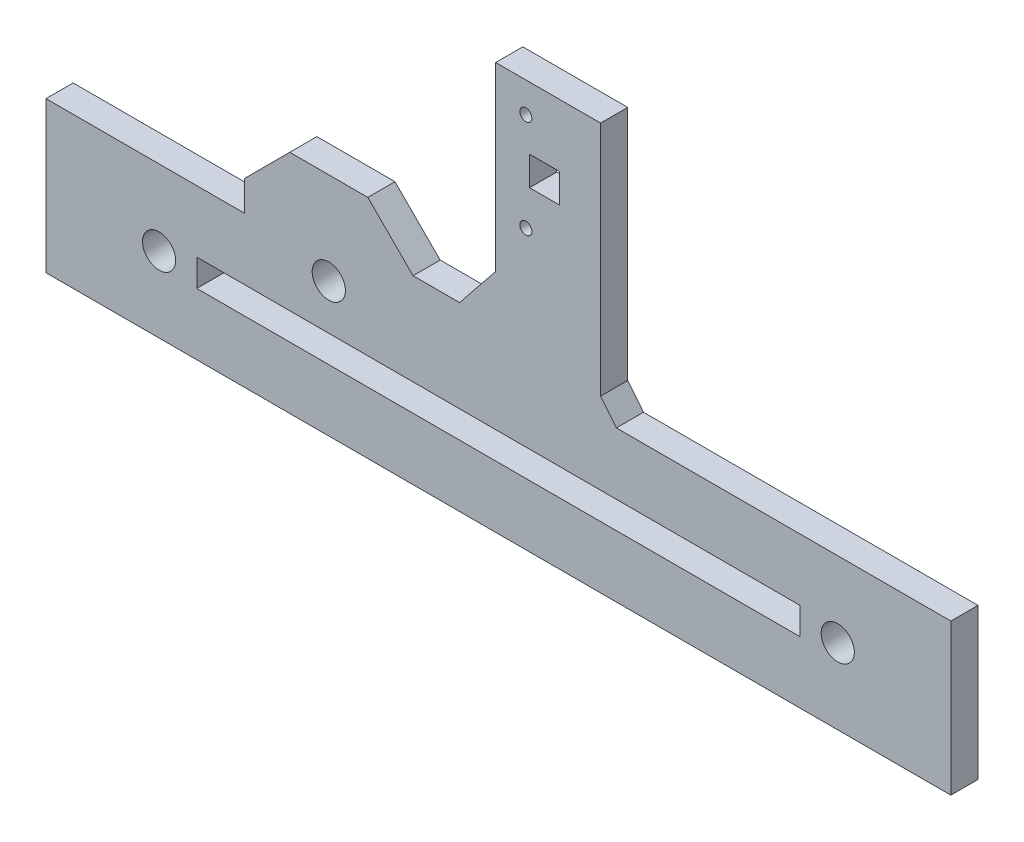
ISO-10303-21;
HEADER;
FILE_DESCRIPTION(('STEP AP214'),'2;1');
FILE_NAME('part.step','',(''),(''),'','','');
FILE_SCHEMA(('AUTOMOTIVE_DESIGN { 1 0 10303 214 1 1 1 1 }'));
ENDSEC;
DATA;
#1=APPLICATION_CONTEXT('core data for automotive mechanical design processes');
#2=APPLICATION_PROTOCOL_DEFINITION('international standard','automotive_design',2000,#1);
#3=PRODUCT_CONTEXT('',#1,'mechanical');
#4=PRODUCT('Part','Part','',(#3));
#5=PRODUCT_RELATED_PRODUCT_CATEGORY('part','',(#4));
#6=PRODUCT_DEFINITION_FORMATION('','',#4);
#7=PRODUCT_DEFINITION_CONTEXT('part definition',#1,'design');
#8=PRODUCT_DEFINITION('design','',#6,#7);
#9=PRODUCT_DEFINITION_SHAPE('','',#8);
#10=(LENGTH_UNIT() NAMED_UNIT(*) SI_UNIT(.MILLI.,.METRE.));
#11=(NAMED_UNIT(*) PLANE_ANGLE_UNIT() SI_UNIT($,.RADIAN.));
#12=(NAMED_UNIT(*) SI_UNIT($,.STERADIAN.) SOLID_ANGLE_UNIT());
#13=UNCERTAINTY_MEASURE_WITH_UNIT(LENGTH_MEASURE(1.E-05),#10,'distance_accuracy_value','');
#14=(GEOMETRIC_REPRESENTATION_CONTEXT(3) GLOBAL_UNCERTAINTY_ASSIGNED_CONTEXT((#13)) GLOBAL_UNIT_ASSIGNED_CONTEXT((#10,
#11,#12)) REPRESENTATION_CONTEXT('',''));
#15=CARTESIAN_POINT('',(0.,0.,0.));
#16=DIRECTION('',(0.,0.,1.));
#17=DIRECTION('',(1.,0.,0.));
#18=AXIS2_PLACEMENT_3D('',#15,#16,#17);
#19=CARTESIAN_POINT('',(-49.841675886682,40.0010063210798,0.));
#20=DIRECTION('',(-0.779893402413548,0.625912358778623,0.));
#21=DIRECTION('',(-0.625912358778623,-0.779893402413548,0.));
#22=AXIS2_PLACEMENT_3D('',#19,#20,#21);
#23=PLANE('',#22);
#24=DIRECTION('',(-0.625912358778623,-0.779893402413548,0.));
#25=VECTOR('',#24,1.);
#26=CARTESIAN_POINT('',(-49.841675886682,40.0010063210798,0.));
#27=LINE('',#26,#25);
#28=CARTESIAN_POINT('',(-1.81686929180978,99.840422,0.));
#29=VERTEX_POINT('',#28);
#30=CARTESIAN_POINT('',(-25.7656408331102,70.,0.));
#31=VERTEX_POINT('',#30);
#32=EDGE_CURVE('E238',#29,#31,#27,.T.);
#33=ORIENTED_EDGE('',*,*,#32,.T.);
#34=DIRECTION('',(0.,0.,1.));
#35=VECTOR('',#34,1.);
#36=CARTESIAN_POINT('',(-25.7656408331102,70.,0.));
#37=LINE('',#36,#35);
#38=CARTESIAN_POINT('',(-25.7656408331102,70.,18.));
#39=VERTEX_POINT('',#38);
#40=EDGE_CURVE('E221',#31,#39,#37,.T.);
#41=ORIENTED_EDGE('',*,*,#40,.T.);
#42=DIRECTION('',(-0.625912358778623,-0.779893402413548,0.));
#43=VECTOR('',#42,1.);
#44=CARTESIAN_POINT('',(-49.841675886682,40.0010063210798,18.));
#45=LINE('',#44,#43);
#46=CARTESIAN_POINT('',(-1.81686929180978,99.840422,18.));
#47=VERTEX_POINT('',#46);
#48=EDGE_CURVE('E257',#47,#39,#45,.T.);
#49=ORIENTED_EDGE('',*,*,#48,.F.);
#50=DIRECTION('',(0.,0.,1.));
#51=VECTOR('',#50,1.);
#52=CARTESIAN_POINT('',(-1.81686929180978,99.840422,0.));
#53=LINE('',#52,#51);
#54=EDGE_CURVE('E273',#29,#47,#53,.T.);
#55=ORIENTED_EDGE('',*,*,#54,.F.);
#56=EDGE_LOOP('',(#33,#41,#49,#55));
#57=FACE_BOUND('',#56,.T.);
#58=ADVANCED_FACE('F36',(#57),#23,.T.);
#59=CARTESIAN_POINT('',(-300.,50.,18.));
#60=DIRECTION('',(0.,-1.,0.));
#61=DIRECTION('',(0.,0.,-1.));
#62=AXIS2_PLACEMENT_3D('',#59,#60,#61);
#63=PLANE('',#62);
#64=DIRECTION('',(0.,0.,1.));
#65=VECTOR('',#64,1.);
#66=CARTESIAN_POINT('',(78.1831307081904,50.,0.));
#67=LINE('',#66,#65);
#68=CARTESIAN_POINT('',(78.1831307081903,50.,0.));
#69=VERTEX_POINT('',#68);
#70=CARTESIAN_POINT('',(78.1831307081903,50.,18.));
#71=VERTEX_POINT('',#70);
#72=EDGE_CURVE('E271',#69,#71,#67,.T.);
#73=ORIENTED_EDGE('',*,*,#72,.T.);
#74=DIRECTION('',(-1.,0.,0.));
#75=VECTOR('',#74,1.);
#76=CARTESIAN_POINT('',(-300.,50.,18.));
#77=LINE('',#76,#75);
#78=CARTESIAN_POINT('',(300.,50.,18.));
#79=VERTEX_POINT('',#78);
#80=EDGE_CURVE('E345',#79,#71,#77,.T.);
#81=ORIENTED_EDGE('',*,*,#80,.F.);
#82=DIRECTION('',(0.,0.,-1.));
#83=VECTOR('',#82,1.);
#84=CARTESIAN_POINT('',(300.,50.,18.));
#85=LINE('',#84,#83);
#86=CARTESIAN_POINT('',(300.,50.,0.));
#87=VERTEX_POINT('',#86);
#88=EDGE_CURVE('E369',#79,#87,#85,.T.);
#89=ORIENTED_EDGE('',*,*,#88,.T.);
#90=DIRECTION('',(-1.,0.,0.));
#91=VECTOR('',#90,1.);
#92=CARTESIAN_POINT('',(-300.,50.,0.));
#93=LINE('',#92,#91);
#94=EDGE_CURVE('E356',#87,#69,#93,.T.);
#95=ORIENTED_EDGE('',*,*,#94,.T.);
#96=EDGE_LOOP('',(#73,#81,#89,#95));
#97=FACE_BOUND('',#96,.T.);
#98=ADVANCED_FACE('F414',(#97),#63,.F.);
#99=DIRECTION('',(0.,0.,1.));
#100=VECTOR('',#99,1.);
#101=CARTESIAN_POINT('',(-168.353087251146,50.,-122.422016476207));
#102=LINE('',#101,#100);
#103=CARTESIAN_POINT('',(-168.353087251146,50.,0.));
#104=VERTEX_POINT('',#103);
#105=CARTESIAN_POINT('',(-168.353087251146,50.,18.));
#106=VERTEX_POINT('',#105);
#107=EDGE_CURVE('E292',#104,#106,#102,.T.);
#108=ORIENTED_EDGE('',*,*,#107,.F.);
#109=CARTESIAN_POINT('',(-300.,50.,0.));
#110=VERTEX_POINT('',#109);
#111=EDGE_CURVE('E355',#104,#110,#93,.T.);
#112=ORIENTED_EDGE('',*,*,#111,.T.);
#113=DIRECTION('',(0.,0.,-1.));
#114=VECTOR('',#113,1.);
#115=CARTESIAN_POINT('',(-300.,50.,18.));
#116=LINE('',#115,#114);
#117=CARTESIAN_POINT('',(-300.,50.,18.));
#118=VERTEX_POINT('',#117);
#119=EDGE_CURVE('E366',#118,#110,#116,.T.);
#120=ORIENTED_EDGE('',*,*,#119,.F.);
#121=EDGE_CURVE('E343',#106,#118,#77,.T.);
#122=ORIENTED_EDGE('',*,*,#121,.F.);
#123=EDGE_LOOP('',(#108,#112,#120,#122));
#124=FACE_BOUND('',#123,.T.);
#125=ADVANCED_FACE('F420',(#124),#63,.F.);
#126=CARTESIAN_POINT('',(300.,-50.,18.));
#127=DIRECTION('',(-1.,0.,0.));
#128=DIRECTION('',(0.,0.,1.));
#129=AXIS2_PLACEMENT_3D('',#126,#127,#128);
#130=PLANE('',#129);
#131=DIRECTION('',(0.,1.,0.));
#132=VECTOR('',#131,1.);
#133=CARTESIAN_POINT('',(300.,-50.,0.));
#134=LINE('',#133,#132);
#135=CARTESIAN_POINT('',(300.,-50.,0.));
#136=VERTEX_POINT('',#135);
#137=EDGE_CURVE('E333',#136,#87,#134,.T.);
#138=ORIENTED_EDGE('',*,*,#137,.T.);
#139=ORIENTED_EDGE('',*,*,#88,.F.);
#140=DIRECTION('',(0.,1.,0.));
#141=VECTOR('',#140,1.);
#142=CARTESIAN_POINT('',(300.,-50.,18.));
#143=LINE('',#142,#141);
#144=CARTESIAN_POINT('',(300.,-50.,18.));
#145=VERTEX_POINT('',#144);
#146=EDGE_CURVE('E340',#145,#79,#143,.T.);
#147=ORIENTED_EDGE('',*,*,#146,.F.);
#148=DIRECTION('',(0.,0.,-1.));
#149=VECTOR('',#148,1.);
#150=CARTESIAN_POINT('',(300.,-50.,18.));
#151=LINE('',#150,#149);
#152=EDGE_CURVE('E352',#145,#136,#151,.T.);
#153=ORIENTED_EDGE('',*,*,#152,.T.);
#154=EDGE_LOOP('',(#138,#139,#147,#153));
#155=FACE_BOUND('',#154,.T.);
#156=ADVANCED_FACE('F490',(#155),#130,.F.);
#157=CARTESIAN_POINT('',(-300.,-50.,18.));
#158=DIRECTION('',(1.,0.,0.));
#159=DIRECTION('',(0.,0.,-1.));
#160=AXIS2_PLACEMENT_3D('',#157,#158,#159);
#161=PLANE('',#160);
#162=DIRECTION('',(0.,-1.,0.));
#163=VECTOR('',#162,1.);
#164=CARTESIAN_POINT('',(-300.,-50.,0.));
#165=LINE('',#164,#163);
#166=CARTESIAN_POINT('',(-300.,-50.,0.));
#167=VERTEX_POINT('',#166);
#168=EDGE_CURVE('E358',#110,#167,#165,.T.);
#169=ORIENTED_EDGE('',*,*,#168,.T.);
#170=DIRECTION('',(0.,0.,-1.));
#171=VECTOR('',#170,1.);
#172=CARTESIAN_POINT('',(-300.,-50.,18.));
#173=LINE('',#172,#171);
#174=CARTESIAN_POINT('',(-300.,-50.,18.));
#175=VERTEX_POINT('',#174);
#176=EDGE_CURVE('E363',#175,#167,#173,.T.);
#177=ORIENTED_EDGE('',*,*,#176,.F.);
#178=DIRECTION('',(0.,-1.,0.));
#179=VECTOR('',#178,1.);
#180=CARTESIAN_POINT('',(-300.,-50.,18.));
#181=LINE('',#180,#179);
#182=EDGE_CURVE('E348',#118,#175,#181,.T.);
#183=ORIENTED_EDGE('',*,*,#182,.F.);
#184=ORIENTED_EDGE('',*,*,#119,.T.);
#185=EDGE_LOOP('',(#169,#177,#183,#184));
#186=FACE_BOUND('',#185,.T.);
#187=ADVANCED_FACE('F487',(#186),#161,.F.);
#188=CARTESIAN_POINT('',(-300.,-50.,18.));
#189=DIRECTION('',(0.,1.,0.));
#190=DIRECTION('',(0.,0.,1.));
#191=AXIS2_PLACEMENT_3D('',#188,#189,#190);
#192=PLANE('',#191);
#193=DIRECTION('',(1.,0.,0.));
#194=VECTOR('',#193,1.);
#195=CARTESIAN_POINT('',(-300.,-50.,0.));
#196=LINE('',#195,#194);
#197=EDGE_CURVE('E344',#167,#136,#196,.T.);
#198=ORIENTED_EDGE('',*,*,#197,.T.);
#199=ORIENTED_EDGE('',*,*,#152,.F.);
#200=DIRECTION('',(1.,0.,0.));
#201=VECTOR('',#200,1.);
#202=CARTESIAN_POINT('',(-300.,-50.,18.));
#203=LINE('',#202,#201);
#204=EDGE_CURVE('E350',#175,#145,#203,.T.);
#205=ORIENTED_EDGE('',*,*,#204,.F.);
#206=ORIENTED_EDGE('',*,*,#176,.T.);
#207=EDGE_LOOP('',(#198,#199,#205,#206));
#208=FACE_BOUND('',#207,.T.);
#209=ADVANCED_FACE('F482',(#208),#192,.F.);
#210=CARTESIAN_POINT('',(0.,0.,18.));
#211=DIRECTION('',(0.,0.,-1.));
#212=DIRECTION('',(-1.,0.,0.));
#213=AXIS2_PLACEMENT_3D('',#210,#211,#212);
#214=PLANE('',#213);
#215=DIRECTION('',(1.,0.,0.));
#216=VECTOR('',#215,1.);
#217=CARTESIAN_POINT('',(20.6231307081902,159.150422,18.));
#218=LINE('',#217,#216);
#219=CARTESIAN_POINT('',(20.6231307081902,159.150422,18.));
#220=VERTEX_POINT('',#219);
#221=CARTESIAN_POINT('',(40.5031307081902,159.150422,18.));
#222=VERTEX_POINT('',#221);
#223=EDGE_CURVE('E202',#220,#222,#218,.T.);
#224=ORIENTED_EDGE('',*,*,#223,.F.);
#225=DIRECTION('',(0.,-1.,0.));
#226=VECTOR('',#225,1.);
#227=CARTESIAN_POINT('',(20.6231307081902,178.430422,18.));
#228=LINE('',#227,#226);
#229=CARTESIAN_POINT('',(20.6231307081902,178.430422,18.));
#230=VERTEX_POINT('',#229);
#231=EDGE_CURVE('E51',#230,#220,#228,.T.);
#232=ORIENTED_EDGE('',*,*,#231,.F.);
#233=DIRECTION('',(1.,0.,0.));
#234=VECTOR('',#233,1.);
#235=CARTESIAN_POINT('',(20.6231307081902,178.430422,18.));
#236=LINE('',#235,#234);
#237=CARTESIAN_POINT('',(40.5031307081902,178.430422,18.));
#238=VERTEX_POINT('',#237);
#239=EDGE_CURVE('E209',#230,#238,#236,.T.);
#240=ORIENTED_EDGE('',*,*,#239,.T.);
#241=DIRECTION('',(0.,-1.,0.));
#242=VECTOR('',#241,1.);
#243=CARTESIAN_POINT('',(40.5031307081902,178.430422,18.));
#244=LINE('',#243,#242);
#245=EDGE_CURVE('E193',#238,#222,#244,.T.);
#246=ORIENTED_EDGE('',*,*,#245,.T.);
#247=EDGE_LOOP('',(#224,#232,#240,#246));
#248=FACE_BOUND('',#247,.T.);
#249=DIRECTION('',(1.,0.,0.));
#250=VECTOR('',#249,1.);
#251=CARTESIAN_POINT('',(-56.6071695713459,70.,18.));
#252=LINE('',#251,#250);
#253=CARTESIAN_POINT('',(-56.6071695713459,70.,18.));
#254=VERTEX_POINT('',#253);
#255=EDGE_CURVE('E216',#254,#39,#252,.T.);
#256=ORIENTED_EDGE('',*,*,#255,.F.);
#257=DIRECTION('',(0.70710678118655,-0.707106781186546,0.));
#258=VECTOR('',#257,1.);
#259=CARTESIAN_POINT('',(-56.6071695713459,70.,18.));
#260=LINE('',#259,#258);
#261=CARTESIAN_POINT('',(-86.607169571346,100.,18.));
#262=VERTEX_POINT('',#261);
#263=EDGE_CURVE('E376',#254,#262,#260,.F.);
#264=ORIENTED_EDGE('',*,*,#263,.T.);
#265=DIRECTION('',(-1.,0.,0.));
#266=VECTOR('',#265,1.);
#267=CARTESIAN_POINT('',(-168.353087251146,100.,18.));
#268=LINE('',#267,#266);
#269=CARTESIAN_POINT('',(-138.353087251146,100.,18.));
#270=VERTEX_POINT('',#269);
#271=EDGE_CURVE('E280',#262,#270,#268,.T.);
#272=ORIENTED_EDGE('',*,*,#271,.T.);
#273=DIRECTION('',(0.707106781186547,0.707106781186548,0.));
#274=VECTOR('',#273,1.);
#275=CARTESIAN_POINT('',(-138.353087251146,100.,18.));
#276=LINE('',#275,#274);
#277=CARTESIAN_POINT('',(-168.353087251146,69.9999999999999,18.));
#278=VERTEX_POINT('',#277);
#279=EDGE_CURVE('E374',#270,#278,#276,.F.);
#280=ORIENTED_EDGE('',*,*,#279,.T.);
#281=DIRECTION('',(0.,-1.,0.));
#282=VECTOR('',#281,1.);
#283=CARTESIAN_POINT('',(-168.353087251146,100.,18.));
#284=LINE('',#283,#282);
#285=EDGE_CURVE('E283',#278,#106,#284,.T.);
#286=ORIENTED_EDGE('',*,*,#285,.T.);
#287=ORIENTED_EDGE('',*,*,#121,.T.);
#288=ORIENTED_EDGE('',*,*,#182,.T.);
#289=ORIENTED_EDGE('',*,*,#204,.T.);
#290=ORIENTED_EDGE('',*,*,#146,.T.);
#291=ORIENTED_EDGE('',*,*,#80,.T.);
#292=DIRECTION('',(0.625912358778624,-0.779893402413547,0.));
#293=VECTOR('',#292,1.);
#294=CARTESIAN_POINT('',(71.9608623187547,57.7530120581683,18.));
#295=LINE('',#294,#293);
#296=CARTESIAN_POINT('',(67.7394409823107,63.0129475793727,18.));
#297=VERTEX_POINT('',#296);
#298=EDGE_CURVE('E260',#297,#71,#295,.T.);
#299=ORIENTED_EDGE('',*,*,#298,.F.);
#300=DIRECTION('',(0.,-1.,0.));
#301=VECTOR('',#300,1.);
#302=CARTESIAN_POINT('',(67.7394409823107,0.,18.));
#303=LINE('',#302,#301);
#304=CARTESIAN_POINT('',(67.7394409823107,219.840422,18.));
#305=VERTEX_POINT('',#304);
#306=EDGE_CURVE('E230',#305,#297,#303,.T.);
#307=ORIENTED_EDGE('',*,*,#306,.F.);
#308=DIRECTION('',(1.,0.,0.));
#309=VECTOR('',#308,1.);
#310=CARTESIAN_POINT('',(0.,219.840422,18.));
#311=LINE('',#310,#309);
#312=CARTESIAN_POINT('',(-1.81686929180978,219.840422,18.));
#313=VERTEX_POINT('',#312);
#314=EDGE_CURVE('E252',#313,#305,#311,.T.);
#315=ORIENTED_EDGE('',*,*,#314,.F.);
#316=DIRECTION('',(0.,1.,0.));
#317=VECTOR('',#316,1.);
#318=CARTESIAN_POINT('',(-1.81686929180977,0.,18.));
#319=LINE('',#318,#317);
#320=EDGE_CURVE('E255',#47,#313,#319,.T.);
#321=ORIENTED_EDGE('',*,*,#320,.F.);
#322=ORIENTED_EDGE('',*,*,#48,.T.);
#323=EDGE_LOOP('',(#256,#264,#272,#280,#286,#287,#288,#289,#290,#291,#299,#307,#315,#321,#322));
#324=FACE_BOUND('',#323,.T.);
#325=CARTESIAN_POINT('',(-112.480128411246,39.,18.));
#326=DIRECTION('',(0.,0.,1.));
#327=DIRECTION('',(1.,0.,0.));
#328=AXIS2_PLACEMENT_3D('',#325,#326,#327);
#329=CIRCLE('',#328,11.);
#330=CARTESIAN_POINT('',(-101.480128411246,39.,18.));
#331=VERTEX_POINT('',#330);
#332=EDGE_CURVE('E267',#331,#331,#329,.T.);
#333=ORIENTED_EDGE('',*,*,#332,.F.);
#334=EDGE_LOOP('',(#333));
#335=FACE_BOUND('',#334,.T.);
#336=CARTESIAN_POINT('',(225.,0.,18.));
#337=DIRECTION('',(0.,0.,-1.));
#338=DIRECTION('',(-1.,0.,0.));
#339=AXIS2_PLACEMENT_3D('',#336,#337,#338);
#340=CIRCLE('',#339,11.);
#341=CARTESIAN_POINT('',(214.,0.,18.));
#342=VERTEX_POINT('',#341);
#343=EDGE_CURVE('E295',#342,#342,#340,.T.);
#344=ORIENTED_EDGE('',*,*,#343,.T.);
#345=EDGE_LOOP('',(#344));
#346=FACE_BOUND('',#345,.T.);
#347=CARTESIAN_POINT('',(-225.,0.,18.));
#348=DIRECTION('',(0.,0.,1.));
#349=DIRECTION('',(1.,0.,0.));
#350=AXIS2_PLACEMENT_3D('',#347,#348,#349);
#351=CIRCLE('',#350,11.);
#352=CARTESIAN_POINT('',(-214.,0.,18.));
#353=VERTEX_POINT('',#352);
#354=EDGE_CURVE('E299',#353,#353,#351,.T.);
#355=ORIENTED_EDGE('',*,*,#354,.F.);
#356=EDGE_LOOP('',(#355));
#357=FACE_BOUND('',#356,.T.);
#358=DIRECTION('',(-1.,0.,0.));
#359=VECTOR('',#358,1.);
#360=CARTESIAN_POINT('',(-200.,9.,18.));
#361=LINE('',#360,#359);
#362=CARTESIAN_POINT('',(200.,9.,18.));
#363=VERTEX_POINT('',#362);
#364=CARTESIAN_POINT('',(-200.,9.,18.));
#365=VERTEX_POINT('',#364);
#366=EDGE_CURVE('E323',#363,#365,#361,.T.);
#367=ORIENTED_EDGE('',*,*,#366,.F.);
#368=DIRECTION('',(0.,1.,0.));
#369=VECTOR('',#368,1.);
#370=CARTESIAN_POINT('',(200.,-9.,18.));
#371=LINE('',#370,#369);
#372=CARTESIAN_POINT('',(200.,-9.,18.));
#373=VERTEX_POINT('',#372);
#374=EDGE_CURVE('E305',#373,#363,#371,.T.);
#375=ORIENTED_EDGE('',*,*,#374,.F.);
#376=DIRECTION('',(1.,0.,0.));
#377=VECTOR('',#376,1.);
#378=CARTESIAN_POINT('',(-200.,-9.,18.));
#379=LINE('',#378,#377);
#380=CARTESIAN_POINT('',(-200.,-9.,18.));
#381=VERTEX_POINT('',#380);
#382=EDGE_CURVE('E312',#381,#373,#379,.T.);
#383=ORIENTED_EDGE('',*,*,#382,.F.);
#384=DIRECTION('',(0.,-1.,0.));
#385=VECTOR('',#384,1.);
#386=CARTESIAN_POINT('',(-200.,-9.,18.));
#387=LINE('',#386,#385);
#388=EDGE_CURVE('E326',#365,#381,#387,.T.);
#389=ORIENTED_EDGE('',*,*,#388,.F.);
#390=EDGE_LOOP('',(#367,#375,#383,#389));
#391=FACE_BOUND('',#390,.T.);
#392=CARTESIAN_POINT('',(18.1831307081902,199.840422,18.));
#393=DIRECTION('',(0.,0.,1.));
#394=DIRECTION('',(1.,0.,0.));
#395=AXIS2_PLACEMENT_3D('',#392,#393,#394);
#396=CIRCLE('',#395,4.00000000000001);
#397=CARTESIAN_POINT('',(22.1831307081902,199.840422,18.));
#398=VERTEX_POINT('',#397);
#399=EDGE_CURVE('E225',#398,#398,#396,.T.);
#400=ORIENTED_EDGE('',*,*,#399,.F.);
#401=EDGE_LOOP('',(#400));
#402=FACE_BOUND('',#401,.T.);
#403=CARTESIAN_POINT('',(18.1831307081902,134.750422,18.));
#404=DIRECTION('',(0.,0.,1.));
#405=DIRECTION('',(1.,0.,0.));
#406=AXIS2_PLACEMENT_3D('',#403,#404,#405);
#407=CIRCLE('',#406,4.00000000000001);
#408=CARTESIAN_POINT('',(22.1831307081902,134.750422,18.));
#409=VERTEX_POINT('',#408);
#410=EDGE_CURVE('E249',#409,#409,#407,.T.);
#411=ORIENTED_EDGE('',*,*,#410,.F.);
#412=EDGE_LOOP('',(#411));
#413=FACE_BOUND('',#412,.T.);
#414=ADVANCED_FACE('F206',(#248,#324,#335,#346,#357,#391,#402,#413),#214,.F.);
#415=CARTESIAN_POINT('',(0.,0.,0.));
#416=DIRECTION('',(0.,0.,-1.));
#417=DIRECTION('',(-1.,0.,0.));
#418=AXIS2_PLACEMENT_3D('',#415,#416,#417);
#419=PLANE('',#418);
#420=DIRECTION('',(0.,1.,0.));
#421=VECTOR('',#420,1.);
#422=CARTESIAN_POINT('',(20.6231307081903,0.,0.));
#423=LINE('',#422,#421);
#424=CARTESIAN_POINT('',(20.6231307081902,159.150422,0.));
#425=VERTEX_POINT('',#424);
#426=CARTESIAN_POINT('',(20.6231307081902,178.430422,0.));
#427=VERTEX_POINT('',#426);
#428=EDGE_CURVE('E11',#425,#427,#423,.T.);
#429=ORIENTED_EDGE('',*,*,#428,.F.);
#430=DIRECTION('',(-1.,0.,0.));
#431=VECTOR('',#430,1.);
#432=CARTESIAN_POINT('',(0.,159.150422,0.));
#433=LINE('',#432,#431);
#434=CARTESIAN_POINT('',(40.5031307081902,159.150422,0.));
#435=VERTEX_POINT('',#434);
#436=EDGE_CURVE('E390',#435,#425,#433,.T.);
#437=ORIENTED_EDGE('',*,*,#436,.F.);
#438=DIRECTION('',(0.,1.,0.));
#439=VECTOR('',#438,1.);
#440=CARTESIAN_POINT('',(40.5031307081902,0.,0.));
#441=LINE('',#440,#439);
#442=CARTESIAN_POINT('',(40.5031307081902,178.430422,0.));
#443=VERTEX_POINT('',#442);
#444=EDGE_CURVE('E196',#435,#443,#441,.T.);
#445=ORIENTED_EDGE('',*,*,#444,.T.);
#446=DIRECTION('',(-1.,0.,0.));
#447=VECTOR('',#446,1.);
#448=CARTESIAN_POINT('',(0.,178.430422,0.));
#449=LINE('',#448,#447);
#450=EDGE_CURVE('E44',#443,#427,#449,.T.);
#451=ORIENTED_EDGE('',*,*,#450,.T.);
#452=EDGE_LOOP('',(#429,#437,#445,#451));
#453=FACE_BOUND('',#452,.T.);
#454=DIRECTION('',(-0.70710678118655,0.707106781186546,0.));
#455=VECTOR('',#454,1.);
#456=CARTESIAN_POINT('',(6.69641521432724,6.69641521432728,0.));
#457=LINE('',#456,#455);
#458=CARTESIAN_POINT('',(-86.607169571346,100.,0.));
#459=VERTEX_POINT('',#458);
#460=CARTESIAN_POINT('',(-56.6071695713459,70.,0.));
#461=VERTEX_POINT('',#460);
#462=EDGE_CURVE('E385',#459,#461,#457,.F.);
#463=ORIENTED_EDGE('',*,*,#462,.T.);
#464=DIRECTION('',(1.,0.,0.));
#465=VECTOR('',#464,1.);
#466=CARTESIAN_POINT('',(-56.6071695713459,70.,0.));
#467=LINE('',#466,#465);
#468=EDGE_CURVE('E219',#461,#31,#467,.T.);
#469=ORIENTED_EDGE('',*,*,#468,.T.);
#470=ORIENTED_EDGE('',*,*,#32,.F.);
#471=DIRECTION('',(0.,1.,0.));
#472=VECTOR('',#471,1.);
#473=CARTESIAN_POINT('',(-1.81686929180977,0.,0.));
#474=LINE('',#473,#472);
#475=CARTESIAN_POINT('',(-1.81686929180978,219.840422,0.));
#476=VERTEX_POINT('',#475);
#477=EDGE_CURVE('E236',#29,#476,#474,.T.);
#478=ORIENTED_EDGE('',*,*,#477,.T.);
#479=DIRECTION('',(1.,0.,0.));
#480=VECTOR('',#479,1.);
#481=CARTESIAN_POINT('',(0.,219.840422,0.));
#482=LINE('',#481,#480);
#483=CARTESIAN_POINT('',(67.7394409823107,219.840422,0.));
#484=VERTEX_POINT('',#483);
#485=EDGE_CURVE('E233',#476,#484,#482,.T.);
#486=ORIENTED_EDGE('',*,*,#485,.T.);
#487=DIRECTION('',(0.,-1.,0.));
#488=VECTOR('',#487,1.);
#489=CARTESIAN_POINT('',(67.7394409823107,0.,0.));
#490=LINE('',#489,#488);
#491=CARTESIAN_POINT('',(67.7394409823107,63.0129475793727,0.));
#492=VERTEX_POINT('',#491);
#493=EDGE_CURVE('E244',#484,#492,#490,.T.);
#494=ORIENTED_EDGE('',*,*,#493,.T.);
#495=DIRECTION('',(0.625912358778624,-0.779893402413547,0.));
#496=VECTOR('',#495,1.);
#497=CARTESIAN_POINT('',(71.9608623187547,57.7530120581683,0.));
#498=LINE('',#497,#496);
#499=EDGE_CURVE('E241',#492,#69,#498,.T.);
#500=ORIENTED_EDGE('',*,*,#499,.T.);
#501=ORIENTED_EDGE('',*,*,#94,.F.);
#502=ORIENTED_EDGE('',*,*,#137,.F.);
#503=ORIENTED_EDGE('',*,*,#197,.F.);
#504=ORIENTED_EDGE('',*,*,#168,.F.);
#505=ORIENTED_EDGE('',*,*,#111,.F.);
#506=DIRECTION('',(0.,-1.,0.));
#507=VECTOR('',#506,1.);
#508=CARTESIAN_POINT('',(-168.353087251146,100.,0.));
#509=LINE('',#508,#507);
#510=CARTESIAN_POINT('',(-168.353087251146,69.9999999999999,0.));
#511=VERTEX_POINT('',#510);
#512=EDGE_CURVE('E290',#511,#104,#509,.T.);
#513=ORIENTED_EDGE('',*,*,#512,.F.);
#514=DIRECTION('',(-0.707106781186547,-0.707106781186548,0.));
#515=VECTOR('',#514,1.);
#516=CARTESIAN_POINT('',(-119.176543625573,119.176543625573,0.));
#517=LINE('',#516,#515);
#518=CARTESIAN_POINT('',(-138.353087251146,100.,0.));
#519=VERTEX_POINT('',#518);
#520=EDGE_CURVE('E383',#511,#519,#517,.F.);
#521=ORIENTED_EDGE('',*,*,#520,.T.);
#522=DIRECTION('',(-1.,0.,0.));
#523=VECTOR('',#522,1.);
#524=CARTESIAN_POINT('',(-168.353087251146,100.,0.));
#525=LINE('',#524,#523);
#526=EDGE_CURVE('E285',#459,#519,#525,.T.);
#527=ORIENTED_EDGE('',*,*,#526,.F.);
#528=EDGE_LOOP('',(#463,#469,#470,#478,#486,#494,#500,#501,#502,#503,#504,#505,#513,#521,#527));
#529=FACE_BOUND('',#528,.T.);
#530=CARTESIAN_POINT('',(-112.480128411246,39.,0.));
#531=DIRECTION('',(0.,0.,1.));
#532=DIRECTION('',(1.,0.,0.));
#533=AXIS2_PLACEMENT_3D('',#530,#531,#532);
#534=CIRCLE('',#533,11.);
#535=CARTESIAN_POINT('',(-101.480128411246,39.,0.));
#536=VERTEX_POINT('',#535);
#537=EDGE_CURVE('E277',#536,#536,#534,.T.);
#538=ORIENTED_EDGE('',*,*,#537,.T.);
#539=EDGE_LOOP('',(#538));
#540=FACE_BOUND('',#539,.T.);
#541=CARTESIAN_POINT('',(225.,0.,0.));
#542=DIRECTION('',(0.,0.,-1.));
#543=DIRECTION('',(-1.,0.,0.));
#544=AXIS2_PLACEMENT_3D('',#541,#542,#543);
#545=CIRCLE('',#544,11.);
#546=CARTESIAN_POINT('',(214.,0.,0.));
#547=VERTEX_POINT('',#546);
#548=EDGE_CURVE('E296',#547,#547,#545,.T.);
#549=ORIENTED_EDGE('',*,*,#548,.F.);
#550=EDGE_LOOP('',(#549));
#551=FACE_BOUND('',#550,.T.);
#552=CARTESIAN_POINT('',(-225.,0.,0.));
#553=DIRECTION('',(0.,0.,1.));
#554=DIRECTION('',(1.,0.,0.));
#555=AXIS2_PLACEMENT_3D('',#552,#553,#554);
#556=CIRCLE('',#555,11.);
#557=CARTESIAN_POINT('',(-214.,0.,0.));
#558=VERTEX_POINT('',#557);
#559=EDGE_CURVE('E302',#558,#558,#556,.T.);
#560=ORIENTED_EDGE('',*,*,#559,.T.);
#561=EDGE_LOOP('',(#560));
#562=FACE_BOUND('',#561,.T.);
#563=DIRECTION('',(0.,1.,0.));
#564=VECTOR('',#563,1.);
#565=CARTESIAN_POINT('',(200.,-9.,0.));
#566=LINE('',#565,#564);
#567=CARTESIAN_POINT('',(200.,-9.,0.));
#568=VERTEX_POINT('',#567);
#569=CARTESIAN_POINT('',(200.,9.,0.));
#570=VERTEX_POINT('',#569);
#571=EDGE_CURVE('E308',#568,#570,#566,.T.);
#572=ORIENTED_EDGE('',*,*,#571,.T.);
#573=DIRECTION('',(-1.,0.,0.));
#574=VECTOR('',#573,1.);
#575=CARTESIAN_POINT('',(-200.,9.,0.));
#576=LINE('',#575,#574);
#577=CARTESIAN_POINT('',(-200.,9.,0.));
#578=VERTEX_POINT('',#577);
#579=EDGE_CURVE('E311',#570,#578,#576,.T.);
#580=ORIENTED_EDGE('',*,*,#579,.T.);
#581=DIRECTION('',(0.,-1.,0.));
#582=VECTOR('',#581,1.);
#583=CARTESIAN_POINT('',(-200.,-9.,0.));
#584=LINE('',#583,#582);
#585=CARTESIAN_POINT('',(-200.,-9.,0.));
#586=VERTEX_POINT('',#585);
#587=EDGE_CURVE('E315',#578,#586,#584,.T.);
#588=ORIENTED_EDGE('',*,*,#587,.T.);
#589=DIRECTION('',(1.,0.,0.));
#590=VECTOR('',#589,1.);
#591=CARTESIAN_POINT('',(-200.,-9.,0.));
#592=LINE('',#591,#590);
#593=EDGE_CURVE('E318',#586,#568,#592,.T.);
#594=ORIENTED_EDGE('',*,*,#593,.T.);
#595=EDGE_LOOP('',(#572,#580,#588,#594));
#596=FACE_BOUND('',#595,.T.);
#597=CARTESIAN_POINT('',(18.1831307081902,199.840422,0.));
#598=DIRECTION('',(0.,0.,1.));
#599=DIRECTION('',(1.,0.,0.));
#600=AXIS2_PLACEMENT_3D('',#597,#598,#599);
#601=CIRCLE('',#600,4.00000000000001);
#602=CARTESIAN_POINT('',(22.1831307081902,199.840422,0.));
#603=VERTEX_POINT('',#602);
#604=EDGE_CURVE('E226',#603,#603,#601,.T.);
#605=ORIENTED_EDGE('',*,*,#604,.T.);
#606=EDGE_LOOP('',(#605));
#607=FACE_BOUND('',#606,.T.);
#608=CARTESIAN_POINT('',(18.1831307081902,134.750422,0.));
#609=DIRECTION('',(0.,0.,1.));
#610=DIRECTION('',(1.,0.,0.));
#611=AXIS2_PLACEMENT_3D('',#608,#609,#610);
#612=CIRCLE('',#611,4.00000000000001);
#613=CARTESIAN_POINT('',(22.1831307081902,134.750422,0.));
#614=VERTEX_POINT('',#613);
#615=EDGE_CURVE('E229',#614,#614,#612,.T.);
#616=ORIENTED_EDGE('',*,*,#615,.T.);
#617=EDGE_LOOP('',(#616));
#618=FACE_BOUND('',#617,.T.);
#619=ADVANCED_FACE('F395',(#453,#529,#540,#551,#562,#596,#607,#618),#419,.T.);
#620=CARTESIAN_POINT('',(200.,-9.,0.));
#621=DIRECTION('',(1.,0.,0.));
#622=DIRECTION('',(0.,0.,-1.));
#623=AXIS2_PLACEMENT_3D('',#620,#621,#622);
#624=PLANE('',#623);
#625=ORIENTED_EDGE('',*,*,#374,.T.);
#626=DIRECTION('',(0.,0.,1.));
#627=VECTOR('',#626,1.);
#628=CARTESIAN_POINT('',(200.,9.,0.));
#629=LINE('',#628,#627);
#630=EDGE_CURVE('E321',#570,#363,#629,.T.);
#631=ORIENTED_EDGE('',*,*,#630,.F.);
#632=ORIENTED_EDGE('',*,*,#571,.F.);
#633=DIRECTION('',(0.,0.,1.));
#634=VECTOR('',#633,1.);
#635=CARTESIAN_POINT('',(200.,-9.,0.));
#636=LINE('',#635,#634);
#637=EDGE_CURVE('E331',#568,#373,#636,.T.);
#638=ORIENTED_EDGE('',*,*,#637,.T.);
#639=EDGE_LOOP('',(#625,#631,#632,#638));
#640=FACE_BOUND('',#639,.T.);
#641=ADVANCED_FACE('F469',(#640),#624,.F.);
#642=CARTESIAN_POINT('',(-200.,-9.,0.));
#643=DIRECTION('',(0.,-1.,0.));
#644=DIRECTION('',(0.,0.,-1.));
#645=AXIS2_PLACEMENT_3D('',#642,#643,#644);
#646=PLANE('',#645);
#647=ORIENTED_EDGE('',*,*,#382,.T.);
#648=ORIENTED_EDGE('',*,*,#637,.F.);
#649=ORIENTED_EDGE('',*,*,#593,.F.);
#650=DIRECTION('',(0.,0.,1.));
#651=VECTOR('',#650,1.);
#652=CARTESIAN_POINT('',(-200.,-9.,0.));
#653=LINE('',#652,#651);
#654=EDGE_CURVE('E334',#586,#381,#653,.T.);
#655=ORIENTED_EDGE('',*,*,#654,.T.);
#656=EDGE_LOOP('',(#647,#648,#649,#655));
#657=FACE_BOUND('',#656,.T.);
#658=ADVANCED_FACE('F465',(#657),#646,.F.);
#659=CARTESIAN_POINT('',(-200.,-9.,0.));
#660=DIRECTION('',(-1.,0.,0.));
#661=DIRECTION('',(0.,0.,1.));
#662=AXIS2_PLACEMENT_3D('',#659,#660,#661);
#663=PLANE('',#662);
#664=ORIENTED_EDGE('',*,*,#388,.T.);
#665=ORIENTED_EDGE('',*,*,#654,.F.);
#666=ORIENTED_EDGE('',*,*,#587,.F.);
#667=DIRECTION('',(0.,0.,1.));
#668=VECTOR('',#667,1.);
#669=CARTESIAN_POINT('',(-200.,9.,0.));
#670=LINE('',#669,#668);
#671=EDGE_CURVE('E336',#578,#365,#670,.T.);
#672=ORIENTED_EDGE('',*,*,#671,.T.);
#673=EDGE_LOOP('',(#664,#665,#666,#672));
#674=FACE_BOUND('',#673,.T.);
#675=ADVANCED_FACE('F468',(#674),#663,.F.);
#676=CARTESIAN_POINT('',(-200.,9.,0.));
#677=DIRECTION('',(0.,1.,0.));
#678=DIRECTION('',(0.,0.,1.));
#679=AXIS2_PLACEMENT_3D('',#676,#677,#678);
#680=PLANE('',#679);
#681=ORIENTED_EDGE('',*,*,#366,.T.);
#682=ORIENTED_EDGE('',*,*,#671,.F.);
#683=ORIENTED_EDGE('',*,*,#579,.F.);
#684=ORIENTED_EDGE('',*,*,#630,.T.);
#685=EDGE_LOOP('',(#681,#682,#683,#684));
#686=FACE_BOUND('',#685,.T.);
#687=ADVANCED_FACE('F463',(#686),#680,.F.);
#688=CARTESIAN_POINT('',(-225.,0.,0.));
#689=DIRECTION('',(0.,0.,1.));
#690=DIRECTION('',(1.,0.,0.));
#691=AXIS2_PLACEMENT_3D('',#688,#689,#690);
#692=CYLINDRICAL_SURFACE('',#691,11.);
#693=ORIENTED_EDGE('',*,*,#559,.F.);
#694=EDGE_LOOP('',(#693));
#695=FACE_BOUND('',#694,.T.);
#696=ORIENTED_EDGE('',*,*,#354,.T.);
#697=EDGE_LOOP('',(#696));
#698=FACE_BOUND('',#697,.T.);
#699=ADVANCED_FACE('F459',(#695,#698),#692,.F.);
#700=CARTESIAN_POINT('',(225.,0.,0.));
#701=DIRECTION('',(0.,0.,1.));
#702=DIRECTION('',(1.,0.,0.));
#703=AXIS2_PLACEMENT_3D('',#700,#701,#702);
#704=CYLINDRICAL_SURFACE('',#703,11.);
#705=ORIENTED_EDGE('',*,*,#548,.T.);
#706=EDGE_LOOP('',(#705));
#707=FACE_BOUND('',#706,.T.);
#708=ORIENTED_EDGE('',*,*,#343,.F.);
#709=EDGE_LOOP('',(#708));
#710=FACE_BOUND('',#709,.T.);
#711=ADVANCED_FACE('F455',(#707,#710),#704,.F.);
#712=CARTESIAN_POINT('',(-168.353087251146,100.,-122.422016476207));
#713=DIRECTION('',(0.,1.,0.));
#714=DIRECTION('',(0.,0.,1.));
#715=AXIS2_PLACEMENT_3D('',#712,#713,#714);
#716=PLANE('',#715);
#717=ORIENTED_EDGE('',*,*,#271,.F.);
#718=DIRECTION('',(0.,0.,-1.));
#719=VECTOR('',#718,1.);
#720=CARTESIAN_POINT('',(-86.607169571346,100.,-122.422016476207));
#721=LINE('',#720,#719);
#722=EDGE_CURVE('E381',#262,#459,#721,.T.);
#723=ORIENTED_EDGE('',*,*,#722,.T.);
#724=ORIENTED_EDGE('',*,*,#526,.T.);
#725=DIRECTION('',(0.,0.,1.));
#726=VECTOR('',#725,1.);
#727=CARTESIAN_POINT('',(-138.353087251146,100.,-122.422016476207));
#728=LINE('',#727,#726);
#729=EDGE_CURVE('E378',#519,#270,#728,.T.);
#730=ORIENTED_EDGE('',*,*,#729,.T.);
#731=EDGE_LOOP('',(#717,#723,#724,#730));
#732=FACE_BOUND('',#731,.T.);
#733=ADVANCED_FACE('F451',(#732),#716,.T.);
#734=CARTESIAN_POINT('',(-168.353087251146,100.,-122.422016476207));
#735=DIRECTION('',(-1.,0.,0.));
#736=DIRECTION('',(0.,0.,1.));
#737=AXIS2_PLACEMENT_3D('',#734,#735,#736);
#738=PLANE('',#737);
#739=ORIENTED_EDGE('',*,*,#285,.F.);
#740=DIRECTION('',(0.,0.,-1.));
#741=VECTOR('',#740,1.);
#742=CARTESIAN_POINT('',(-168.353087251146,69.9999999999999,-122.422016476207));
#743=LINE('',#742,#741);
#744=EDGE_CURVE('E388',#278,#511,#743,.T.);
#745=ORIENTED_EDGE('',*,*,#744,.T.);
#746=ORIENTED_EDGE('',*,*,#512,.T.);
#747=ORIENTED_EDGE('',*,*,#107,.T.);
#748=EDGE_LOOP('',(#739,#745,#746,#747));
#749=FACE_BOUND('',#748,.T.);
#750=ADVANCED_FACE('F447',(#749),#738,.T.);
#751=CARTESIAN_POINT('',(-112.480128411246,39.,0.));
#752=DIRECTION('',(0.,0.,1.));
#753=DIRECTION('',(1.,0.,0.));
#754=AXIS2_PLACEMENT_3D('',#751,#752,#753);
#755=CYLINDRICAL_SURFACE('',#754,11.);
#756=ORIENTED_EDGE('',*,*,#537,.F.);
#757=EDGE_LOOP('',(#756));
#758=FACE_BOUND('',#757,.T.);
#759=ORIENTED_EDGE('',*,*,#332,.T.);
#760=EDGE_LOOP('',(#759));
#761=FACE_BOUND('',#760,.T.);
#762=ADVANCED_FACE('F443',(#758,#761),#755,.F.);
#763=CARTESIAN_POINT('',(-56.6071695713459,70.,-122.422016476207));
#764=DIRECTION('',(-0.707106781186545,-0.707106781186549,0.));
#765=DIRECTION('',(0.,0.,1.));
#766=AXIS2_PLACEMENT_3D('',#763,#764,#765);
#767=PLANE('',#766);
#768=ORIENTED_EDGE('',*,*,#462,.F.);
#769=ORIENTED_EDGE('',*,*,#722,.F.);
#770=ORIENTED_EDGE('',*,*,#263,.F.);
#771=DIRECTION('',(0.,0.,1.));
#772=VECTOR('',#771,1.);
#773=CARTESIAN_POINT('',(-56.6071695713459,70.,-122.422016476207));
#774=LINE('',#773,#772);
#775=EDGE_CURVE('E372',#461,#254,#774,.T.);
#776=ORIENTED_EDGE('',*,*,#775,.F.);
#777=EDGE_LOOP('',(#768,#769,#770,#776));
#778=FACE_BOUND('',#777,.T.);
#779=ADVANCED_FACE('F446',(#778),#767,.F.);
#780=CARTESIAN_POINT('',(-138.353087251146,100.,-122.422016476207));
#781=DIRECTION('',(0.707106781186548,-0.707106781186547,0.));
#782=DIRECTION('',(0.,0.,1.));
#783=AXIS2_PLACEMENT_3D('',#780,#781,#782);
#784=PLANE('',#783);
#785=ORIENTED_EDGE('',*,*,#520,.F.);
#786=ORIENTED_EDGE('',*,*,#744,.F.);
#787=ORIENTED_EDGE('',*,*,#279,.F.);
#788=ORIENTED_EDGE('',*,*,#729,.F.);
#789=EDGE_LOOP('',(#785,#786,#787,#788));
#790=FACE_BOUND('',#789,.T.);
#791=ADVANCED_FACE('F38',(#790),#784,.F.);
#792=CARTESIAN_POINT('',(0.,219.840422,0.));
#793=DIRECTION('',(0.,-1.,0.));
#794=DIRECTION('',(0.,0.,-1.));
#795=AXIS2_PLACEMENT_3D('',#792,#793,#794);
#796=PLANE('',#795);
#797=ORIENTED_EDGE('',*,*,#314,.T.);
#798=DIRECTION('',(0.,0.,1.));
#799=VECTOR('',#798,1.);
#800=CARTESIAN_POINT('',(67.7394409823107,219.840422,0.));
#801=LINE('',#800,#799);
#802=EDGE_CURVE('E264',#484,#305,#801,.T.);
#803=ORIENTED_EDGE('',*,*,#802,.F.);
#804=ORIENTED_EDGE('',*,*,#485,.F.);
#805=DIRECTION('',(0.,0.,1.));
#806=VECTOR('',#805,1.);
#807=CARTESIAN_POINT('',(-1.81686929180978,219.840422,0.));
#808=LINE('',#807,#806);
#809=EDGE_CURVE('E246',#476,#313,#808,.T.);
#810=ORIENTED_EDGE('',*,*,#809,.T.);
#811=EDGE_LOOP('',(#797,#803,#804,#810));
#812=FACE_BOUND('',#811,.T.);
#813=ADVANCED_FACE('F431',(#812),#796,.F.);
#814=CARTESIAN_POINT('',(67.7394409823107,0.,0.));
#815=DIRECTION('',(-1.,0.,0.));
#816=DIRECTION('',(0.,0.,1.));
#817=AXIS2_PLACEMENT_3D('',#814,#815,#816);
#818=PLANE('',#817);
#819=ORIENTED_EDGE('',*,*,#306,.T.);
#820=DIRECTION('',(0.,0.,1.));
#821=VECTOR('',#820,1.);
#822=CARTESIAN_POINT('',(67.7394409823107,63.0129475793727,0.));
#823=LINE('',#822,#821);
#824=EDGE_CURVE('E268',#492,#297,#823,.T.);
#825=ORIENTED_EDGE('',*,*,#824,.F.);
#826=ORIENTED_EDGE('',*,*,#493,.F.);
#827=ORIENTED_EDGE('',*,*,#802,.T.);
#828=EDGE_LOOP('',(#819,#825,#826,#827));
#829=FACE_BOUND('',#828,.T.);
#830=ADVANCED_FACE('F434',(#829),#818,.F.);
#831=CARTESIAN_POINT('',(71.9608623187547,57.7530120581683,0.));
#832=DIRECTION('',(-0.779893402413547,-0.625912358778624,0.));
#833=DIRECTION('',(0.625912358778624,-0.779893402413547,0.));
#834=AXIS2_PLACEMENT_3D('',#831,#832,#833);
#835=PLANE('',#834);
#836=ORIENTED_EDGE('',*,*,#298,.T.);
#837=ORIENTED_EDGE('',*,*,#72,.F.);
#838=ORIENTED_EDGE('',*,*,#499,.F.);
#839=ORIENTED_EDGE('',*,*,#824,.T.);
#840=EDGE_LOOP('',(#836,#837,#838,#839));
#841=FACE_BOUND('',#840,.T.);
#842=ADVANCED_FACE('F425',(#841),#835,.F.);
#843=CARTESIAN_POINT('',(18.1831307081902,134.750422,0.));
#844=DIRECTION('',(0.,0.,1.));
#845=DIRECTION('',(1.,0.,0.));
#846=AXIS2_PLACEMENT_3D('',#843,#844,#845);
#847=CYLINDRICAL_SURFACE('',#846,4.00000000000001);
#848=ORIENTED_EDGE('',*,*,#615,.F.);
#849=EDGE_LOOP('',(#848));
#850=FACE_BOUND('',#849,.T.);
#851=ORIENTED_EDGE('',*,*,#410,.T.);
#852=EDGE_LOOP('',(#851));
#853=FACE_BOUND('',#852,.T.);
#854=ADVANCED_FACE('F436',(#850,#853),#847,.F.);
#855=CARTESIAN_POINT('',(18.1831307081902,199.840422,0.));
#856=DIRECTION('',(0.,0.,1.));
#857=DIRECTION('',(1.,0.,0.));
#858=AXIS2_PLACEMENT_3D('',#855,#856,#857);
#859=CYLINDRICAL_SURFACE('',#858,4.00000000000001);
#860=ORIENTED_EDGE('',*,*,#604,.F.);
#861=EDGE_LOOP('',(#860));
#862=FACE_BOUND('',#861,.T.);
#863=ORIENTED_EDGE('',*,*,#399,.T.);
#864=EDGE_LOOP('',(#863));
#865=FACE_BOUND('',#864,.T.);
#866=ADVANCED_FACE('F429',(#862,#865),#859,.F.);
#867=CARTESIAN_POINT('',(-1.81686929180977,0.,0.));
#868=DIRECTION('',(1.,0.,0.));
#869=DIRECTION('',(0.,1.,0.));
#870=AXIS2_PLACEMENT_3D('',#867,#868,#869);
#871=PLANE('',#870);
#872=ORIENTED_EDGE('',*,*,#320,.T.);
#873=ORIENTED_EDGE('',*,*,#809,.F.);
#874=ORIENTED_EDGE('',*,*,#477,.F.);
#875=ORIENTED_EDGE('',*,*,#54,.T.);
#876=EDGE_LOOP('',(#872,#873,#874,#875));
#877=FACE_BOUND('',#876,.T.);
#878=ADVANCED_FACE('F409',(#877),#871,.F.);
#879=CARTESIAN_POINT('',(-56.6071695713459,70.,0.));
#880=DIRECTION('',(0.,-1.,0.));
#881=DIRECTION('',(0.,0.,-1.));
#882=AXIS2_PLACEMENT_3D('',#879,#880,#881);
#883=PLANE('',#882);
#884=ORIENTED_EDGE('',*,*,#255,.T.);
#885=ORIENTED_EDGE('',*,*,#40,.F.);
#886=ORIENTED_EDGE('',*,*,#468,.F.);
#887=ORIENTED_EDGE('',*,*,#775,.T.);
#888=EDGE_LOOP('',(#884,#885,#886,#887));
#889=FACE_BOUND('',#888,.T.);
#890=ADVANCED_FACE('F402',(#889),#883,.F.);
#891=CARTESIAN_POINT('',(20.6231307081902,178.430422,-2.00000000000001));
#892=DIRECTION('',(-1.,0.,0.));
#893=DIRECTION('',(0.,-1.,0.));
#894=AXIS2_PLACEMENT_3D('',#891,#892,#893);
#895=PLANE('',#894);
#896=ORIENTED_EDGE('',*,*,#428,.T.);
#897=DIRECTION('',(0.,0.,1.));
#898=VECTOR('',#897,1.);
#899=CARTESIAN_POINT('',(20.6231307081902,178.430422,-2.00000000000001));
#900=LINE('',#899,#898);
#901=EDGE_CURVE('E214',#427,#230,#900,.T.);
#902=ORIENTED_EDGE('',*,*,#901,.T.);
#903=ORIENTED_EDGE('',*,*,#231,.T.);
#904=DIRECTION('',(0.,0.,1.));
#905=VECTOR('',#904,1.);
#906=CARTESIAN_POINT('',(20.6231307081902,159.150422,-2.00000000000001));
#907=LINE('',#906,#905);
#908=EDGE_CURVE('E199',#425,#220,#907,.T.);
#909=ORIENTED_EDGE('',*,*,#908,.F.);
#910=EDGE_LOOP('',(#896,#902,#903,#909));
#911=FACE_BOUND('',#910,.T.);
#912=ADVANCED_FACE('F400',(#911),#895,.F.);
#913=CARTESIAN_POINT('',(20.6231307081902,178.430422,-2.00000000000001));
#914=DIRECTION('',(0.,-1.,0.));
#915=DIRECTION('',(0.,0.,-1.));
#916=AXIS2_PLACEMENT_3D('',#913,#914,#915);
#917=PLANE('',#916);
#918=DIRECTION('',(0.,0.,1.));
#919=VECTOR('',#918,1.);
#920=CARTESIAN_POINT('',(40.5031307081902,178.430422,-2.00000000000001));
#921=LINE('',#920,#919);
#922=EDGE_CURVE('E198',#443,#238,#921,.T.);
#923=ORIENTED_EDGE('',*,*,#922,.T.);
#924=ORIENTED_EDGE('',*,*,#239,.F.);
#925=ORIENTED_EDGE('',*,*,#901,.F.);
#926=ORIENTED_EDGE('',*,*,#450,.F.);
#927=EDGE_LOOP('',(#923,#924,#925,#926));
#928=FACE_BOUND('',#927,.T.);
#929=ADVANCED_FACE('F399',(#928),#917,.T.);
#930=CARTESIAN_POINT('',(40.5031307081902,178.430422,-2.00000000000001));
#931=DIRECTION('',(-1.,0.,0.));
#932=DIRECTION('',(0.,0.,1.));
#933=AXIS2_PLACEMENT_3D('',#930,#931,#932);
#934=PLANE('',#933);
#935=DIRECTION('',(0.,0.,1.));
#936=VECTOR('',#935,1.);
#937=CARTESIAN_POINT('',(40.5031307081902,159.150422,-2.00000000000001));
#938=LINE('',#937,#936);
#939=EDGE_CURVE('E59',#435,#222,#938,.T.);
#940=ORIENTED_EDGE('',*,*,#939,.T.);
#941=ORIENTED_EDGE('',*,*,#245,.F.);
#942=ORIENTED_EDGE('',*,*,#922,.F.);
#943=ORIENTED_EDGE('',*,*,#444,.F.);
#944=EDGE_LOOP('',(#940,#941,#942,#943));
#945=FACE_BOUND('',#944,.T.);
#946=ADVANCED_FACE('F190',(#945),#934,.T.);
#947=CARTESIAN_POINT('',(20.6231307081902,159.150422,-2.00000000000001));
#948=DIRECTION('',(0.,-1.,0.));
#949=DIRECTION('',(0.,0.,-1.));
#950=AXIS2_PLACEMENT_3D('',#947,#948,#949);
#951=PLANE('',#950);
#952=ORIENTED_EDGE('',*,*,#436,.T.);
#953=ORIENTED_EDGE('',*,*,#908,.T.);
#954=ORIENTED_EDGE('',*,*,#223,.T.);
#955=ORIENTED_EDGE('',*,*,#939,.F.);
#956=EDGE_LOOP('',(#952,#953,#954,#955));
#957=FACE_BOUND('',#956,.T.);
#958=ADVANCED_FACE('F203',(#957),#951,.F.);
#959=CLOSED_SHELL('',(#58,#98,#125,#156,#187,#209,#414,#619,#641,#658,#675,#687,#699,#711,#733,
#750,#762,#779,#791,#813,#830,#842,#854,#866,#878,#890,#912,#929,#946,#958));
#960=MANIFOLD_SOLID_BREP('B2',#959);
#961=ADVANCED_BREP_SHAPE_REPRESENTATION('',(#18,#960),#14);
#962=SHAPE_DEFINITION_REPRESENTATION(#9,#961);
ENDSEC;
END-ISO-10303-21;
